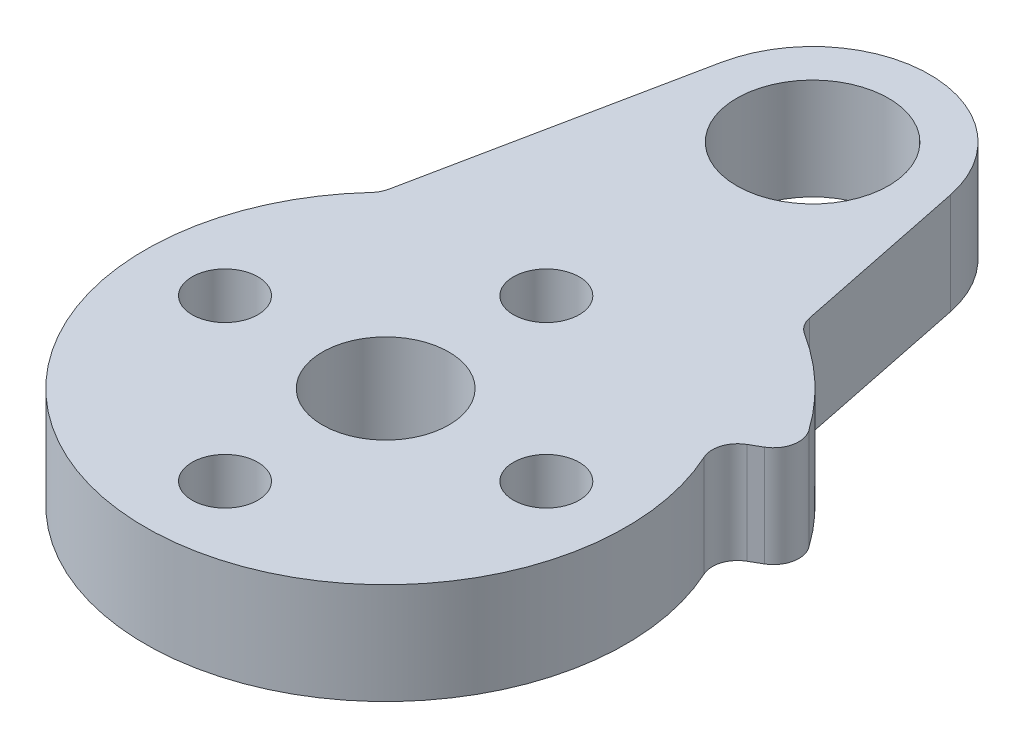
ISO-10303-21;
HEADER;
FILE_DESCRIPTION(('STEP AP214'),'2;1');
FILE_NAME('part.step','',(''),(''),'','','');
FILE_SCHEMA(('AUTOMOTIVE_DESIGN { 1 0 10303 214 1 1 1 1 }'));
ENDSEC;
DATA;
#1=APPLICATION_CONTEXT('core data for automotive mechanical design processes');
#2=APPLICATION_PROTOCOL_DEFINITION('international standard','automotive_design',2000,#1);
#3=PRODUCT_CONTEXT('',#1,'mechanical');
#4=PRODUCT('Part','Part','',(#3));
#5=PRODUCT_RELATED_PRODUCT_CATEGORY('part','',(#4));
#6=PRODUCT_DEFINITION_FORMATION('','',#4);
#7=PRODUCT_DEFINITION_CONTEXT('part definition',#1,'design');
#8=PRODUCT_DEFINITION('design','',#6,#7);
#9=PRODUCT_DEFINITION_SHAPE('','',#8);
#10=(LENGTH_UNIT() NAMED_UNIT(*) SI_UNIT(.MILLI.,.METRE.));
#11=(NAMED_UNIT(*) PLANE_ANGLE_UNIT() SI_UNIT($,.RADIAN.));
#12=(NAMED_UNIT(*) SI_UNIT($,.STERADIAN.) SOLID_ANGLE_UNIT());
#13=UNCERTAINTY_MEASURE_WITH_UNIT(LENGTH_MEASURE(1.E-05),#10,'distance_accuracy_value','');
#14=(GEOMETRIC_REPRESENTATION_CONTEXT(3) GLOBAL_UNCERTAINTY_ASSIGNED_CONTEXT((#13)) GLOBAL_UNIT_ASSIGNED_CONTEXT((#10,
#11,#12)) REPRESENTATION_CONTEXT('',''));
#15=CARTESIAN_POINT('',(0.,0.,0.));
#16=DIRECTION('',(0.,0.,1.));
#17=DIRECTION('',(1.,0.,0.));
#18=AXIS2_PLACEMENT_3D('',#15,#16,#17);
#19=CARTESIAN_POINT('',(0.,4.,-16.87456));
#20=DIRECTION('',(0.,1.,0.));
#21=DIRECTION('',(0.,0.,1.));
#22=AXIS2_PLACEMENT_3D('',#19,#20,#21);
#23=PLANE('',#22);
#24=DIRECTION('',(0.866025403784439,0.,-0.5));
#25=VECTOR('',#24,1.);
#26=CARTESIAN_POINT('',(8.22724133595217,4.,-4.75));
#27=LINE('',#26,#25);
#28=CARTESIAN_POINT('',(9.05193349511583,4.,-5.22613624009172));
#29=VERTEX_POINT('',#28);
#30=CARTESIAN_POINT('',(9.48683298050514,4.,-5.47722557505166));
#31=VERTEX_POINT('',#30);
#32=EDGE_CURVE('E225',#29,#31,#27,.T.);
#33=ORIENTED_EDGE('',*,*,#32,.T.);
#34=CARTESIAN_POINT('',(8.98683298050514,4.,-6.3432509788361));
#35=DIRECTION('',(0.,1.,0.));
#36=DIRECTION('',(0.,0.,1.));
#37=AXIS2_PLACEMENT_3D('',#34,#35,#36);
#38=CIRCLE('',#37,1.);
#39=CARTESIAN_POINT('',(9.80381779691469,4.,-6.91991015873029));
#40=VERTEX_POINT('',#39);
#41=EDGE_CURVE('E57',#31,#40,#38,.T.);
#42=ORIENTED_EDGE('',*,*,#41,.T.);
#43=CARTESIAN_POINT('',(0.,4.,0.));
#44=DIRECTION('',(0.,1.,0.));
#45=DIRECTION('',(0.,0.,1.));
#46=AXIS2_PLACEMENT_3D('',#43,#44,#45);
#47=CIRCLE('',#46,12.);
#48=CARTESIAN_POINT('',(6.40799701854467,4.,-10.1458156010408));
#49=VERTEX_POINT('',#48);
#50=EDGE_CURVE('E197',#40,#49,#47,.T.);
#51=ORIENTED_EDGE('',*,*,#50,.T.);
#52=CARTESIAN_POINT('',(6.94199677009006,4.,-10.9913002344608));
#53=DIRECTION('',(0.,1.,0.));
#54=DIRECTION('',(0.,0.,1.));
#55=AXIS2_PLACEMENT_3D('',#52,#53,#54);
#56=CIRCLE('',#55,1.);
#57=CARTESIAN_POINT('',(5.96220087297679,4.,-10.7913002344608));
#58=VERTEX_POINT('',#57);
#59=EDGE_CURVE('E191',#49,#58,#56,.F.);
#60=ORIENTED_EDGE('',*,*,#59,.T.);
#61=DIRECTION('',(-0.2,0.,-0.979795897113271));
#62=VECTOR('',#61,1.);
#63=CARTESIAN_POINT('',(4.53164224618782,4.,-17.7995776));
#64=LINE('',#63,#62);
#65=CARTESIAN_POINT('',(4.53164224618782,4.,-17.7995776));
#66=VERTEX_POINT('',#65);
#67=EDGE_CURVE('E130',#58,#66,#64,.T.);
#68=ORIENTED_EDGE('',*,*,#67,.T.);
#69=CARTESIAN_POINT('',(0.,4.,-16.87456));
#70=DIRECTION('',(0.,1.,0.));
#71=DIRECTION('',(0.,0.,1.));
#72=AXIS2_PLACEMENT_3D('',#69,#70,#71);
#73=CIRCLE('',#72,4.625088);
#74=CARTESIAN_POINT('',(-4.53164224618782,4.,-17.7995776));
#75=VERTEX_POINT('',#74);
#76=EDGE_CURVE('E131',#66,#75,#73,.T.);
#77=ORIENTED_EDGE('',*,*,#76,.T.);
#78=DIRECTION('',(-0.2,0.,0.979795897113271));
#79=VECTOR('',#78,1.);
#80=CARTESIAN_POINT('',(-4.53164224618782,4.,-17.7995776));
#81=LINE('',#80,#79);
#82=CARTESIAN_POINT('',(-6.75670179426697,4.,-6.8990565197967));
#83=VERTEX_POINT('',#82);
#84=EDGE_CURVE('E120',#75,#83,#81,.T.);
#85=ORIENTED_EDGE('',*,*,#84,.T.);
#86=CARTESIAN_POINT('',(-7.73649769138025,4.,-7.09905651979671));
#87=DIRECTION('',(0.,1.,0.));
#88=DIRECTION('',(0.,0.,1.));
#89=AXIS2_PLACEMENT_3D('',#86,#87,#88);
#90=CIRCLE('',#89,1.);
#91=CARTESIAN_POINT('',(-6.99968838743927,4.,-6.42295589886369));
#92=VERTEX_POINT('',#91);
#93=EDGE_CURVE('E182',#83,#92,#90,.F.);
#94=ORIENTED_EDGE('',*,*,#93,.T.);
#95=CARTESIAN_POINT('',(0.,4.,0.));
#96=DIRECTION('',(0.,1.,0.));
#97=DIRECTION('',(0.,0.,1.));
#98=AXIS2_PLACEMENT_3D('',#95,#96,#97);
#99=CIRCLE('',#98,9.5);
#100=CARTESIAN_POINT('',(8.64222554320004,4.,-3.9448621852304));
#101=VERTEX_POINT('',#100);
#102=EDGE_CURVE('E217',#92,#101,#99,.T.);
#103=ORIENTED_EDGE('',*,*,#102,.T.);
#104=CARTESIAN_POINT('',(9.55193349511584,4.,-4.36011083630728));
#105=DIRECTION('',(0.,1.,0.));
#106=DIRECTION('',(0.,0.,1.));
#107=AXIS2_PLACEMENT_3D('',#104,#105,#106);
#108=CIRCLE('',#107,1.);
#109=EDGE_CURVE('E50',#101,#29,#108,.F.);
#110=ORIENTED_EDGE('',*,*,#109,.T.);
#111=EDGE_LOOP('',(#33,#42,#51,#60,#68,#77,#85,#94,#103,#110));
#112=FACE_BOUND('',#111,.T.);
#113=CARTESIAN_POINT('',(0.,4.,-6.35));
#114=DIRECTION('',(0.,1.,0.));
#115=DIRECTION('',(0.,0.,1.));
#116=AXIS2_PLACEMENT_3D('',#113,#114,#115);
#117=CIRCLE('',#116,1.3);
#118=CARTESIAN_POINT('',(0.,4.,-5.05));
#119=VERTEX_POINT('',#118);
#120=EDGE_CURVE('E241',#119,#119,#117,.T.);
#121=ORIENTED_EDGE('',*,*,#120,.F.);
#122=EDGE_LOOP('',(#121));
#123=FACE_BOUND('',#122,.T.);
#124=CARTESIAN_POINT('',(6.35000000000018,4.,-1.79311378806878E-13));
#125=DIRECTION('',(0.,1.,0.));
#126=DIRECTION('',(0.,0.,1.));
#127=AXIS2_PLACEMENT_3D('',#124,#125,#126);
#128=CIRCLE('',#127,1.30000000000014);
#129=CARTESIAN_POINT('',(6.35000000000018,4.,1.29999999999996));
#130=VERTEX_POINT('',#129);
#131=EDGE_CURVE('E249',#130,#130,#128,.T.);
#132=ORIENTED_EDGE('',*,*,#131,.F.);
#133=EDGE_LOOP('',(#132));
#134=FACE_BOUND('',#133,.T.);
#135=CARTESIAN_POINT('',(3.58622757613755E-13,4.,6.35));
#136=DIRECTION('',(0.,1.,0.));
#137=DIRECTION('',(0.,0.,1.));
#138=AXIS2_PLACEMENT_3D('',#135,#136,#137);
#139=CIRCLE('',#138,1.30000000000039);
#140=CARTESIAN_POINT('',(3.58622757613755E-13,4.,7.65000000000039));
#141=VERTEX_POINT('',#140);
#142=EDGE_CURVE('E257',#141,#141,#139,.T.);
#143=ORIENTED_EDGE('',*,*,#142,.F.);
#144=EDGE_LOOP('',(#143));
#145=FACE_BOUND('',#144,.T.);
#146=CARTESIAN_POINT('',(-6.34999999999982,4.,1.80089029524336E-13));
#147=DIRECTION('',(0.,1.,0.));
#148=DIRECTION('',(0.,0.,1.));
#149=AXIS2_PLACEMENT_3D('',#146,#147,#148);
#150=CIRCLE('',#149,1.30000000000029);
#151=CARTESIAN_POINT('',(-6.34999999999982,4.,1.30000000000047));
#152=VERTEX_POINT('',#151);
#153=EDGE_CURVE('E234',#152,#152,#150,.T.);
#154=ORIENTED_EDGE('',*,*,#153,.F.);
#155=EDGE_LOOP('',(#154));
#156=FACE_BOUND('',#155,.T.);
#157=CARTESIAN_POINT('',(0.,4.,-16.87456));
#158=DIRECTION('',(0.,1.,0.));
#159=DIRECTION('',(0.,0.,1.));
#160=AXIS2_PLACEMENT_3D('',#157,#158,#159);
#161=CIRCLE('',#160,3.);
#162=CARTESIAN_POINT('',(0.,4.,-13.87456));
#163=VERTEX_POINT('',#162);
#164=EDGE_CURVE('E276',#163,#163,#161,.T.);
#165=ORIENTED_EDGE('',*,*,#164,.F.);
#166=EDGE_LOOP('',(#165));
#167=FACE_BOUND('',#166,.T.);
#168=CARTESIAN_POINT('',(0.,4.,0.));
#169=DIRECTION('',(0.,1.,0.));
#170=DIRECTION('',(0.,0.,1.));
#171=AXIS2_PLACEMENT_3D('',#168,#169,#170);
#172=CIRCLE('',#171,2.5);
#173=CARTESIAN_POINT('',(0.,4.,2.5));
#174=VERTEX_POINT('',#173);
#175=EDGE_CURVE('E268',#174,#174,#172,.T.);
#176=ORIENTED_EDGE('',*,*,#175,.F.);
#177=EDGE_LOOP('',(#176));
#178=FACE_BOUND('',#177,.T.);
#179=ADVANCED_FACE('F41',(#112,#123,#134,#145,#156,#167,#178),#23,.T.);
#180=CARTESIAN_POINT('',(0.,0.,-16.87456));
#181=DIRECTION('',(0.,1.,0.));
#182=DIRECTION('',(0.,0.,1.));
#183=AXIS2_PLACEMENT_3D('',#180,#181,#182);
#184=PLANE('',#183);
#185=CARTESIAN_POINT('',(0.,0.,0.));
#186=DIRECTION('',(0.,1.,0.));
#187=DIRECTION('',(0.,0.,1.));
#188=AXIS2_PLACEMENT_3D('',#185,#186,#187);
#189=CIRCLE('',#188,12.);
#190=CARTESIAN_POINT('',(6.40799701854467,0.,-10.1458156010408));
#191=VERTEX_POINT('',#190);
#192=CARTESIAN_POINT('',(9.80381779691469,0.,-6.91991015873029));
#193=VERTEX_POINT('',#192);
#194=EDGE_CURVE('E212',#191,#193,#189,.F.);
#195=ORIENTED_EDGE('',*,*,#194,.T.);
#196=CARTESIAN_POINT('',(8.98683298050514,0.,-6.3432509788361));
#197=DIRECTION('',(0.,1.,0.));
#198=DIRECTION('',(0.,0.,1.));
#199=AXIS2_PLACEMENT_3D('',#196,#197,#198);
#200=CIRCLE('',#199,1.);
#201=CARTESIAN_POINT('',(9.48683298050514,0.,-5.47722557505166));
#202=VERTEX_POINT('',#201);
#203=EDGE_CURVE('E179',#193,#202,#200,.F.);
#204=ORIENTED_EDGE('',*,*,#203,.T.);
#205=DIRECTION('',(-0.866025403784439,0.,0.5));
#206=VECTOR('',#205,1.);
#207=CARTESIAN_POINT('',(8.22724133595217,0.,-4.75));
#208=LINE('',#207,#206);
#209=CARTESIAN_POINT('',(9.05193349511583,0.,-5.22613624009172));
#210=VERTEX_POINT('',#209);
#211=EDGE_CURVE('E218',#202,#210,#208,.T.);
#212=ORIENTED_EDGE('',*,*,#211,.T.);
#213=CARTESIAN_POINT('',(9.55193349511584,0.,-4.36011083630728));
#214=DIRECTION('',(0.,1.,0.));
#215=DIRECTION('',(0.,0.,1.));
#216=AXIS2_PLACEMENT_3D('',#213,#214,#215);
#217=CIRCLE('',#216,1.);
#218=CARTESIAN_POINT('',(8.64222554320004,0.,-3.9448621852304));
#219=VERTEX_POINT('',#218);
#220=EDGE_CURVE('E11',#210,#219,#217,.T.);
#221=ORIENTED_EDGE('',*,*,#220,.T.);
#222=CARTESIAN_POINT('',(0.,0.,0.));
#223=DIRECTION('',(0.,1.,0.));
#224=DIRECTION('',(0.,0.,1.));
#225=AXIS2_PLACEMENT_3D('',#222,#223,#224);
#226=CIRCLE('',#225,9.5);
#227=CARTESIAN_POINT('',(-6.99968838743927,0.,-6.42295589886369));
#228=VERTEX_POINT('',#227);
#229=EDGE_CURVE('E222',#228,#219,#226,.T.);
#230=ORIENTED_EDGE('',*,*,#229,.F.);
#231=CARTESIAN_POINT('',(-7.73649769138025,0.,-7.09905651979671));
#232=DIRECTION('',(0.,1.,0.));
#233=DIRECTION('',(0.,0.,1.));
#234=AXIS2_PLACEMENT_3D('',#231,#232,#233);
#235=CIRCLE('',#234,1.);
#236=CARTESIAN_POINT('',(-6.75670179426697,0.,-6.8990565197967));
#237=VERTEX_POINT('',#236);
#238=EDGE_CURVE('E185',#228,#237,#235,.T.);
#239=ORIENTED_EDGE('',*,*,#238,.T.);
#240=DIRECTION('',(-0.2,0.,0.979795897113271));
#241=VECTOR('',#240,1.);
#242=CARTESIAN_POINT('',(-4.53164224618782,0.,-17.7995776));
#243=LINE('',#242,#241);
#244=CARTESIAN_POINT('',(-4.53164224618782,0.,-17.7995776));
#245=VERTEX_POINT('',#244);
#246=EDGE_CURVE('E285',#245,#237,#243,.T.);
#247=ORIENTED_EDGE('',*,*,#246,.F.);
#248=CARTESIAN_POINT('',(0.,0.,-16.87456));
#249=DIRECTION('',(0.,1.,0.));
#250=DIRECTION('',(0.,0.,1.));
#251=AXIS2_PLACEMENT_3D('',#248,#249,#250);
#252=CIRCLE('',#251,4.625088);
#253=CARTESIAN_POINT('',(4.53164224618782,0.,-17.7995776));
#254=VERTEX_POINT('',#253);
#255=EDGE_CURVE('E144',#254,#245,#252,.T.);
#256=ORIENTED_EDGE('',*,*,#255,.F.);
#257=DIRECTION('',(-0.2,0.,-0.979795897113271));
#258=VECTOR('',#257,1.);
#259=CARTESIAN_POINT('',(4.53164224618782,0.,-17.7995776));
#260=LINE('',#259,#258);
#261=CARTESIAN_POINT('',(5.96220087297679,0.,-10.7913002344608));
#262=VERTEX_POINT('',#261);
#263=EDGE_CURVE('E140',#262,#254,#260,.T.);
#264=ORIENTED_EDGE('',*,*,#263,.F.);
#265=CARTESIAN_POINT('',(6.94199677009006,0.,-10.9913002344608));
#266=DIRECTION('',(0.,1.,0.));
#267=DIRECTION('',(0.,0.,1.));
#268=AXIS2_PLACEMENT_3D('',#265,#266,#267);
#269=CIRCLE('',#268,1.);
#270=EDGE_CURVE('E188',#262,#191,#269,.T.);
#271=ORIENTED_EDGE('',*,*,#270,.T.);
#272=EDGE_LOOP('',(#195,#204,#212,#221,#230,#239,#247,#256,#264,#271));
#273=FACE_BOUND('',#272,.T.);
#274=CARTESIAN_POINT('',(0.,0.,-6.35));
#275=DIRECTION('',(0.,1.,0.));
#276=DIRECTION('',(0.,0.,1.));
#277=AXIS2_PLACEMENT_3D('',#274,#275,#276);
#278=CIRCLE('',#277,1.3);
#279=CARTESIAN_POINT('',(0.,0.,-5.05));
#280=VERTEX_POINT('',#279);
#281=EDGE_CURVE('E236',#280,#280,#278,.T.);
#282=ORIENTED_EDGE('',*,*,#281,.T.);
#283=EDGE_LOOP('',(#282));
#284=FACE_BOUND('',#283,.T.);
#285=CARTESIAN_POINT('',(6.35000000000018,0.,-1.79311378806878E-13));
#286=DIRECTION('',(0.,1.,0.));
#287=DIRECTION('',(0.,0.,1.));
#288=AXIS2_PLACEMENT_3D('',#285,#286,#287);
#289=CIRCLE('',#288,1.30000000000014);
#290=CARTESIAN_POINT('',(6.35000000000018,0.,1.29999999999996));
#291=VERTEX_POINT('',#290);
#292=EDGE_CURVE('E245',#291,#291,#289,.T.);
#293=ORIENTED_EDGE('',*,*,#292,.T.);
#294=EDGE_LOOP('',(#293));
#295=FACE_BOUND('',#294,.T.);
#296=CARTESIAN_POINT('',(3.58622757613755E-13,0.,6.35));
#297=DIRECTION('',(0.,1.,0.));
#298=DIRECTION('',(0.,0.,1.));
#299=AXIS2_PLACEMENT_3D('',#296,#297,#298);
#300=CIRCLE('',#299,1.30000000000039);
#301=CARTESIAN_POINT('',(3.58622757613755E-13,0.,7.65000000000039));
#302=VERTEX_POINT('',#301);
#303=EDGE_CURVE('E253',#302,#302,#300,.T.);
#304=ORIENTED_EDGE('',*,*,#303,.T.);
#305=EDGE_LOOP('',(#304));
#306=FACE_BOUND('',#305,.T.);
#307=CARTESIAN_POINT('',(-6.34999999999982,0.,1.80089029524336E-13));
#308=DIRECTION('',(0.,1.,0.));
#309=DIRECTION('',(0.,0.,1.));
#310=AXIS2_PLACEMENT_3D('',#307,#308,#309);
#311=CIRCLE('',#310,1.30000000000029);
#312=CARTESIAN_POINT('',(-6.34999999999982,0.,1.30000000000047));
#313=VERTEX_POINT('',#312);
#314=EDGE_CURVE('E261',#313,#313,#311,.T.);
#315=ORIENTED_EDGE('',*,*,#314,.T.);
#316=EDGE_LOOP('',(#315));
#317=FACE_BOUND('',#316,.T.);
#318=CARTESIAN_POINT('',(0.,0.,-16.87456));
#319=DIRECTION('',(0.,1.,0.));
#320=DIRECTION('',(0.,0.,1.));
#321=AXIS2_PLACEMENT_3D('',#318,#319,#320);
#322=CIRCLE('',#321,3.);
#323=CARTESIAN_POINT('',(0.,0.,-13.87456));
#324=VERTEX_POINT('',#323);
#325=EDGE_CURVE('E272',#324,#324,#322,.T.);
#326=ORIENTED_EDGE('',*,*,#325,.T.);
#327=EDGE_LOOP('',(#326));
#328=FACE_BOUND('',#327,.T.);
#329=CARTESIAN_POINT('',(0.,0.,0.));
#330=DIRECTION('',(0.,1.,0.));
#331=DIRECTION('',(0.,0.,1.));
#332=AXIS2_PLACEMENT_3D('',#329,#330,#331);
#333=CIRCLE('',#332,2.5);
#334=CARTESIAN_POINT('',(0.,0.,2.5));
#335=VERTEX_POINT('',#334);
#336=EDGE_CURVE('E240',#335,#335,#333,.T.);
#337=ORIENTED_EDGE('',*,*,#336,.T.);
#338=EDGE_LOOP('',(#337));
#339=FACE_BOUND('',#338,.T.);
#340=ADVANCED_FACE('F210',(#273,#284,#295,#306,#317,#328,#339),#184,.F.);
#341=CARTESIAN_POINT('',(0.,4.,-16.87456));
#342=DIRECTION('',(0.,-1.,0.));
#343=DIRECTION('',(0.,0.,-1.));
#344=AXIS2_PLACEMENT_3D('',#341,#342,#343);
#345=CYLINDRICAL_SURFACE('',#344,4.625088);
#346=ORIENTED_EDGE('',*,*,#255,.T.);
#347=DIRECTION('',(0.,-1.,0.));
#348=VECTOR('',#347,1.);
#349=CARTESIAN_POINT('',(-4.53164224618782,4.,-17.7995776));
#350=LINE('',#349,#348);
#351=EDGE_CURVE('E125',#75,#245,#350,.T.);
#352=ORIENTED_EDGE('',*,*,#351,.F.);
#353=ORIENTED_EDGE('',*,*,#76,.F.);
#354=DIRECTION('',(0.,-1.,0.));
#355=VECTOR('',#354,1.);
#356=CARTESIAN_POINT('',(4.53164224618782,4.,-17.7995776));
#357=LINE('',#356,#355);
#358=EDGE_CURVE('E146',#66,#254,#357,.T.);
#359=ORIENTED_EDGE('',*,*,#358,.T.);
#360=EDGE_LOOP('',(#346,#352,#353,#359));
#361=FACE_BOUND('',#360,.T.);
#362=ADVANCED_FACE('F142',(#361),#345,.T.);
#363=CARTESIAN_POINT('',(-4.53164224618782,4.,-17.7995776));
#364=DIRECTION('',(0.979795897113271,0.,0.2));
#365=DIRECTION('',(0.2,0.,-0.979795897113271));
#366=AXIS2_PLACEMENT_3D('',#363,#364,#365);
#367=PLANE('',#366);
#368=ORIENTED_EDGE('',*,*,#246,.T.);
#369=DIRECTION('',(0.,1.,0.));
#370=VECTOR('',#369,1.);
#371=CARTESIAN_POINT('',(-6.75670179426697,4.,-6.89905651979671));
#372=LINE('',#371,#370);
#373=EDGE_CURVE('E128',#237,#83,#372,.T.);
#374=ORIENTED_EDGE('',*,*,#373,.T.);
#375=ORIENTED_EDGE('',*,*,#84,.F.);
#376=ORIENTED_EDGE('',*,*,#351,.T.);
#377=EDGE_LOOP('',(#368,#374,#375,#376));
#378=FACE_BOUND('',#377,.T.);
#379=ADVANCED_FACE('F123',(#378),#367,.F.);
#380=CARTESIAN_POINT('',(4.53164224618782,4.,-17.7995776));
#381=DIRECTION('',(-0.979795897113271,0.,0.2));
#382=DIRECTION('',(0.2,0.,0.979795897113271));
#383=AXIS2_PLACEMENT_3D('',#380,#381,#382);
#384=PLANE('',#383);
#385=ORIENTED_EDGE('',*,*,#67,.F.);
#386=DIRECTION('',(0.,1.,0.));
#387=VECTOR('',#386,1.);
#388=CARTESIAN_POINT('',(5.96220087297679,4.,-10.7913002344608));
#389=LINE('',#388,#387);
#390=EDGE_CURVE('E161',#58,#262,#389,.F.);
#391=ORIENTED_EDGE('',*,*,#390,.T.);
#392=ORIENTED_EDGE('',*,*,#263,.T.);
#393=ORIENTED_EDGE('',*,*,#358,.F.);
#394=EDGE_LOOP('',(#385,#391,#392,#393));
#395=FACE_BOUND('',#394,.T.);
#396=ADVANCED_FACE('F202',(#395),#384,.F.);
#397=CARTESIAN_POINT('',(0.,4.,-16.87456));
#398=DIRECTION('',(0.,-1.,0.));
#399=DIRECTION('',(0.,0.,-1.));
#400=AXIS2_PLACEMENT_3D('',#397,#398,#399);
#401=CYLINDRICAL_SURFACE('',#400,3.);
#402=ORIENTED_EDGE('',*,*,#164,.T.);
#403=EDGE_LOOP('',(#402));
#404=FACE_BOUND('',#403,.T.);
#405=ORIENTED_EDGE('',*,*,#325,.F.);
#406=EDGE_LOOP('',(#405));
#407=FACE_BOUND('',#406,.T.);
#408=ADVANCED_FACE('F315',(#404,#407),#401,.F.);
#409=CARTESIAN_POINT('',(0.,4.,0.));
#410=DIRECTION('',(0.,-1.,0.));
#411=DIRECTION('',(0.,0.,-1.));
#412=AXIS2_PLACEMENT_3D('',#409,#410,#411);
#413=CYLINDRICAL_SURFACE('',#412,2.5);
#414=ORIENTED_EDGE('',*,*,#175,.T.);
#415=EDGE_LOOP('',(#414));
#416=FACE_BOUND('',#415,.T.);
#417=ORIENTED_EDGE('',*,*,#336,.F.);
#418=EDGE_LOOP('',(#417));
#419=FACE_BOUND('',#418,.T.);
#420=ADVANCED_FACE('F416',(#416,#419),#413,.F.);
#421=CARTESIAN_POINT('',(-6.34999999999982,0.,1.80089029524336E-13));
#422=DIRECTION('',(0.,1.,0.));
#423=DIRECTION('',(0.,0.,1.));
#424=AXIS2_PLACEMENT_3D('',#421,#422,#423);
#425=CYLINDRICAL_SURFACE('',#424,1.30000000000029);
#426=ORIENTED_EDGE('',*,*,#314,.F.);
#427=EDGE_LOOP('',(#426));
#428=FACE_BOUND('',#427,.T.);
#429=ORIENTED_EDGE('',*,*,#153,.T.);
#430=EDGE_LOOP('',(#429));
#431=FACE_BOUND('',#430,.T.);
#432=ADVANCED_FACE('F425',(#428,#431),#425,.F.);
#433=CARTESIAN_POINT('',(3.58622757613755E-13,0.,6.35));
#434=DIRECTION('',(0.,1.,0.));
#435=DIRECTION('',(0.,0.,1.));
#436=AXIS2_PLACEMENT_3D('',#433,#434,#435);
#437=CYLINDRICAL_SURFACE('',#436,1.30000000000039);
#438=ORIENTED_EDGE('',*,*,#303,.F.);
#439=EDGE_LOOP('',(#438));
#440=FACE_BOUND('',#439,.T.);
#441=ORIENTED_EDGE('',*,*,#142,.T.);
#442=EDGE_LOOP('',(#441));
#443=FACE_BOUND('',#442,.T.);
#444=ADVANCED_FACE('F434',(#440,#443),#437,.F.);
#445=CARTESIAN_POINT('',(6.35000000000018,0.,-1.79311378806878E-13));
#446=DIRECTION('',(0.,1.,0.));
#447=DIRECTION('',(0.,0.,1.));
#448=AXIS2_PLACEMENT_3D('',#445,#446,#447);
#449=CYLINDRICAL_SURFACE('',#448,1.30000000000014);
#450=ORIENTED_EDGE('',*,*,#292,.F.);
#451=EDGE_LOOP('',(#450));
#452=FACE_BOUND('',#451,.T.);
#453=ORIENTED_EDGE('',*,*,#131,.T.);
#454=EDGE_LOOP('',(#453));
#455=FACE_BOUND('',#454,.T.);
#456=ADVANCED_FACE('F444',(#452,#455),#449,.F.);
#457=CARTESIAN_POINT('',(0.,0.,-6.35));
#458=DIRECTION('',(0.,1.,0.));
#459=DIRECTION('',(0.,0.,1.));
#460=AXIS2_PLACEMENT_3D('',#457,#458,#459);
#461=CYLINDRICAL_SURFACE('',#460,1.3);
#462=ORIENTED_EDGE('',*,*,#281,.F.);
#463=EDGE_LOOP('',(#462));
#464=FACE_BOUND('',#463,.T.);
#465=ORIENTED_EDGE('',*,*,#120,.T.);
#466=EDGE_LOOP('',(#465));
#467=FACE_BOUND('',#466,.T.);
#468=ADVANCED_FACE('F388',(#464,#467),#461,.F.);
#469=CARTESIAN_POINT('',(0.,0.,0.));
#470=DIRECTION('',(0.,1.,0.));
#471=DIRECTION('',(0.,0.,1.));
#472=AXIS2_PLACEMENT_3D('',#469,#470,#471);
#473=CYLINDRICAL_SURFACE('',#472,9.5);
#474=ORIENTED_EDGE('',*,*,#102,.F.);
#475=DIRECTION('',(0.,1.,0.));
#476=VECTOR('',#475,1.);
#477=CARTESIAN_POINT('',(-6.99968838743927,0.,-6.42295589886369));
#478=LINE('',#477,#476);
#479=EDGE_CURVE('E158',#92,#228,#478,.F.);
#480=ORIENTED_EDGE('',*,*,#479,.T.);
#481=ORIENTED_EDGE('',*,*,#229,.T.);
#482=DIRECTION('',(0.,1.,0.));
#483=VECTOR('',#482,1.);
#484=CARTESIAN_POINT('',(8.64222554320004,0.,-3.9448621852304));
#485=LINE('',#484,#483);
#486=EDGE_CURVE('E150',#219,#101,#485,.T.);
#487=ORIENTED_EDGE('',*,*,#486,.T.);
#488=EDGE_LOOP('',(#474,#480,#481,#487));
#489=FACE_BOUND('',#488,.T.);
#490=ADVANCED_FACE('F295',(#489),#473,.T.);
#491=CARTESIAN_POINT('',(0.,-12.6713258974742,0.));
#492=DIRECTION('',(0.,1.,0.));
#493=DIRECTION('',(0.,0.,1.));
#494=AXIS2_PLACEMENT_3D('',#491,#492,#493);
#495=CYLINDRICAL_SURFACE('',#494,12.);
#496=ORIENTED_EDGE('',*,*,#194,.F.);
#497=DIRECTION('',(0.,1.,0.));
#498=VECTOR('',#497,1.);
#499=CARTESIAN_POINT('',(6.40799701854468,-12.6713258974742,-10.1458156010408));
#500=LINE('',#499,#498);
#501=EDGE_CURVE('E168',#191,#49,#500,.T.);
#502=ORIENTED_EDGE('',*,*,#501,.T.);
#503=ORIENTED_EDGE('',*,*,#50,.F.);
#504=DIRECTION('',(0.,1.,0.));
#505=VECTOR('',#504,1.);
#506=CARTESIAN_POINT('',(9.8038177969147,-12.6713258974742,-6.91991015873029));
#507=LINE('',#506,#505);
#508=EDGE_CURVE('E165',#40,#193,#507,.F.);
#509=ORIENTED_EDGE('',*,*,#508,.T.);
#510=EDGE_LOOP('',(#496,#502,#503,#509));
#511=FACE_BOUND('',#510,.T.);
#512=ADVANCED_FACE('F215',(#511),#495,.T.);
#513=CARTESIAN_POINT('',(8.22724133595217,-12.6713258974742,-4.75));
#514=DIRECTION('',(0.5,0.,0.866025403784439));
#515=DIRECTION('',(0.866025403784439,0.,-0.5));
#516=AXIS2_PLACEMENT_3D('',#513,#514,#515);
#517=PLANE('',#516);
#518=ORIENTED_EDGE('',*,*,#32,.F.);
#519=DIRECTION('',(0.,-1.,0.));
#520=VECTOR('',#519,1.);
#521=CARTESIAN_POINT('',(9.05193349511583,0.,-5.22613624009172));
#522=LINE('',#521,#520);
#523=EDGE_CURVE('E174',#29,#210,#522,.T.);
#524=ORIENTED_EDGE('',*,*,#523,.T.);
#525=ORIENTED_EDGE('',*,*,#211,.F.);
#526=DIRECTION('',(0.,1.,0.));
#527=VECTOR('',#526,1.);
#528=CARTESIAN_POINT('',(9.48683298050514,-12.6713258974742,-5.47722557505166));
#529=LINE('',#528,#527);
#530=EDGE_CURVE('E171',#202,#31,#529,.T.);
#531=ORIENTED_EDGE('',*,*,#530,.T.);
#532=EDGE_LOOP('',(#518,#524,#525,#531));
#533=FACE_BOUND('',#532,.T.);
#534=ADVANCED_FACE('F303',(#533),#517,.T.);
#535=CARTESIAN_POINT('',(-7.73649769138025,0.,-7.09905651979671));
#536=DIRECTION('',(0.,1.,0.));
#537=DIRECTION('',(0.,0.,1.));
#538=AXIS2_PLACEMENT_3D('',#535,#536,#537);
#539=CYLINDRICAL_SURFACE('',#538,1.);
#540=ORIENTED_EDGE('',*,*,#238,.F.);
#541=ORIENTED_EDGE('',*,*,#479,.F.);
#542=ORIENTED_EDGE('',*,*,#93,.F.);
#543=ORIENTED_EDGE('',*,*,#373,.F.);
#544=EDGE_LOOP('',(#540,#541,#542,#543));
#545=FACE_BOUND('',#544,.T.);
#546=ADVANCED_FACE('F291',(#545),#539,.F.);
#547=CARTESIAN_POINT('',(6.94199677009006,-12.6713258974742,-10.9913002344608));
#548=DIRECTION('',(0.,1.,0.));
#549=DIRECTION('',(0.,0.,1.));
#550=AXIS2_PLACEMENT_3D('',#547,#548,#549);
#551=CYLINDRICAL_SURFACE('',#550,1.);
#552=ORIENTED_EDGE('',*,*,#59,.F.);
#553=ORIENTED_EDGE('',*,*,#501,.F.);
#554=ORIENTED_EDGE('',*,*,#270,.F.);
#555=ORIENTED_EDGE('',*,*,#390,.F.);
#556=EDGE_LOOP('',(#552,#553,#554,#555));
#557=FACE_BOUND('',#556,.T.);
#558=ADVANCED_FACE('F206',(#557),#551,.F.);
#559=CARTESIAN_POINT('',(9.55193349511584,0.,-4.36011083630728));
#560=DIRECTION('',(0.,1.,0.));
#561=DIRECTION('',(0.,0.,1.));
#562=AXIS2_PLACEMENT_3D('',#559,#560,#561);
#563=CYLINDRICAL_SURFACE('',#562,1.);
#564=ORIENTED_EDGE('',*,*,#220,.F.);
#565=ORIENTED_EDGE('',*,*,#523,.F.);
#566=ORIENTED_EDGE('',*,*,#109,.F.);
#567=ORIENTED_EDGE('',*,*,#486,.F.);
#568=EDGE_LOOP('',(#564,#565,#566,#567));
#569=FACE_BOUND('',#568,.T.);
#570=ADVANCED_FACE('F299',(#569),#563,.F.);
#571=CARTESIAN_POINT('',(8.98683298050514,-12.6713258974742,-6.3432509788361));
#572=DIRECTION('',(0.,1.,0.));
#573=DIRECTION('',(0.,0.,1.));
#574=AXIS2_PLACEMENT_3D('',#571,#572,#573);
#575=CYLINDRICAL_SURFACE('',#574,1.);
#576=ORIENTED_EDGE('',*,*,#203,.F.);
#577=ORIENTED_EDGE('',*,*,#508,.F.);
#578=ORIENTED_EDGE('',*,*,#41,.F.);
#579=ORIENTED_EDGE('',*,*,#530,.F.);
#580=EDGE_LOOP('',(#576,#577,#578,#579));
#581=FACE_BOUND('',#580,.T.);
#582=ADVANCED_FACE('F43',(#581),#575,.T.);
#583=CLOSED_SHELL('',(#179,#340,#362,#379,#396,#408,#420,#432,#444,#456,#468,#490,#512,#534,
#546,#558,#570,#582));
#584=MANIFOLD_SOLID_BREP('B2',#583);
#585=ADVANCED_BREP_SHAPE_REPRESENTATION('',(#18,#584),#14);
#586=SHAPE_DEFINITION_REPRESENTATION(#9,#585);
ENDSEC;
END-ISO-10303-21;
